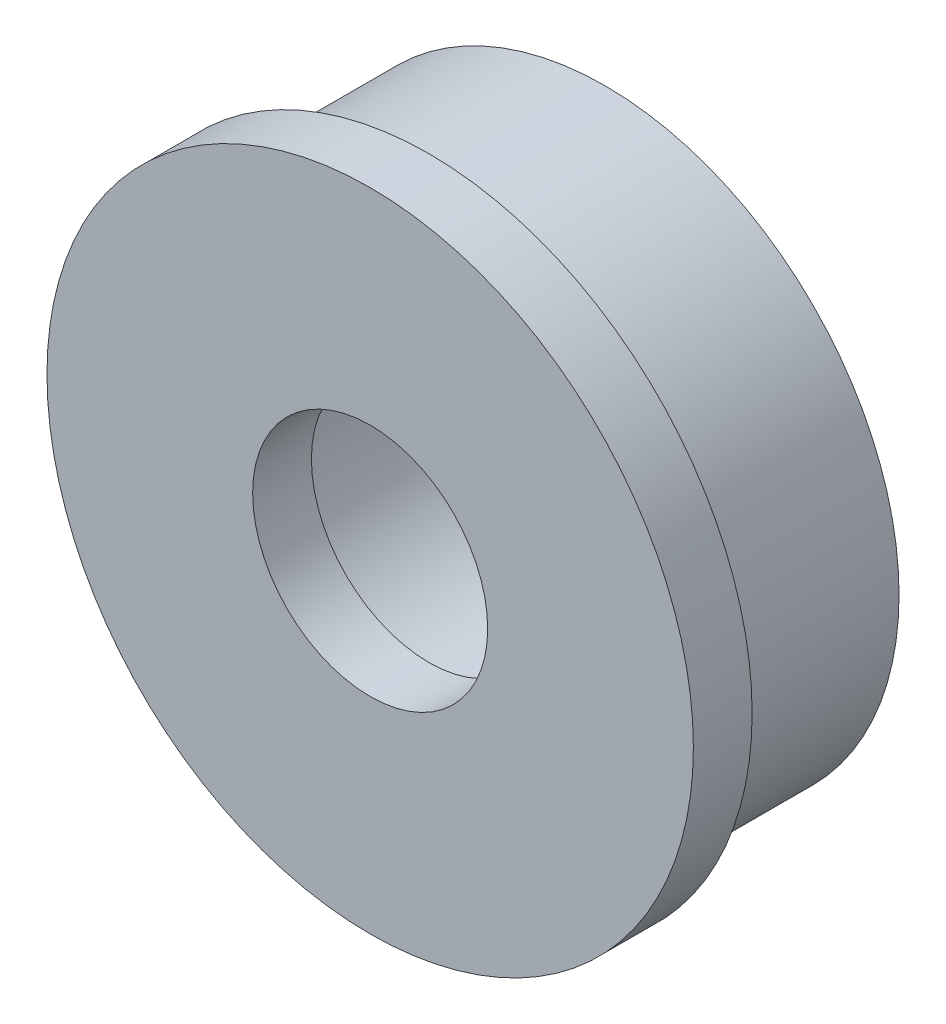
ISO-10303-21;
HEADER;
FILE_DESCRIPTION(('STEP AP214'),'2;1');
FILE_NAME('part.step','',(''),(''),'','','');
FILE_SCHEMA(('AUTOMOTIVE_DESIGN { 1 0 10303 214 1 1 1 1 }'));
ENDSEC;
DATA;
#1=APPLICATION_CONTEXT('core data for automotive mechanical design processes');
#2=APPLICATION_PROTOCOL_DEFINITION('international standard','automotive_design',2000,#1);
#3=PRODUCT_CONTEXT('',#1,'mechanical');
#4=PRODUCT('Part','Part','',(#3));
#5=PRODUCT_RELATED_PRODUCT_CATEGORY('part','',(#4));
#6=PRODUCT_DEFINITION_FORMATION('','',#4);
#7=PRODUCT_DEFINITION_CONTEXT('part definition',#1,'design');
#8=PRODUCT_DEFINITION('design','',#6,#7);
#9=PRODUCT_DEFINITION_SHAPE('','',#8);
#10=(LENGTH_UNIT() NAMED_UNIT(*) SI_UNIT(.MILLI.,.METRE.));
#11=(NAMED_UNIT(*) PLANE_ANGLE_UNIT() SI_UNIT($,.RADIAN.));
#12=(NAMED_UNIT(*) SI_UNIT($,.STERADIAN.) SOLID_ANGLE_UNIT());
#13=UNCERTAINTY_MEASURE_WITH_UNIT(LENGTH_MEASURE(1.E-05),#10,'distance_accuracy_value','');
#14=(GEOMETRIC_REPRESENTATION_CONTEXT(3) GLOBAL_UNCERTAINTY_ASSIGNED_CONTEXT((#13)) GLOBAL_UNIT_ASSIGNED_CONTEXT((#10,
#11,#12)) REPRESENTATION_CONTEXT('',''));
#15=CARTESIAN_POINT('',(0.,0.,0.));
#16=DIRECTION('',(0.,0.,1.));
#17=DIRECTION('',(1.,0.,0.));
#18=AXIS2_PLACEMENT_3D('',#15,#16,#17);
#19=CARTESIAN_POINT('',(0.,0.,0.));
#20=DIRECTION('',(0.,0.,1.));
#21=DIRECTION('',(1.,0.,0.));
#22=AXIS2_PLACEMENT_3D('',#19,#20,#21);
#23=PLANE('',#22);
#24=CARTESIAN_POINT('',(0.,0.,0.));
#25=DIRECTION('',(0.,0.,1.));
#26=DIRECTION('',(1.,0.,0.));
#27=AXIS2_PLACEMENT_3D('',#24,#25,#26);
#28=CIRCLE('',#27,5.);
#29=CARTESIAN_POINT('',(5.,0.,0.));
#30=VERTEX_POINT('',#29);
#31=EDGE_CURVE('E36',#30,#30,#28,.T.);
#32=ORIENTED_EDGE('',*,*,#31,.F.);
#33=EDGE_LOOP('',(#32));
#34=FACE_BOUND('',#33,.T.);
#35=CARTESIAN_POINT('',(0.,0.,0.));
#36=DIRECTION('',(0.,0.,1.));
#37=DIRECTION('',(1.,0.,0.));
#38=AXIS2_PLACEMENT_3D('',#35,#36,#37);
#39=CIRCLE('',#38,2.5);
#40=CARTESIAN_POINT('',(2.5,0.,0.));
#41=VERTEX_POINT('',#40);
#42=EDGE_CURVE('E43',#41,#41,#39,.T.);
#43=ORIENTED_EDGE('',*,*,#42,.T.);
#44=EDGE_LOOP('',(#43));
#45=FACE_BOUND('',#44,.T.);
#46=ADVANCED_FACE('F32',(#34,#45),#23,.F.);
#47=CARTESIAN_POINT('',(0.,0.,3.));
#48=DIRECTION('',(0.,0.,-1.));
#49=DIRECTION('',(-1.,0.,0.));
#50=AXIS2_PLACEMENT_3D('',#47,#48,#49);
#51=CYLINDRICAL_SURFACE('',#50,5.);
#52=CARTESIAN_POINT('',(0.,0.,3.));
#53=DIRECTION('',(0.,0.,1.));
#54=DIRECTION('',(1.,0.,0.));
#55=AXIS2_PLACEMENT_3D('',#52,#53,#54);
#56=CIRCLE('',#55,5.);
#57=CARTESIAN_POINT('',(5.,0.,3.));
#58=VERTEX_POINT('',#57);
#59=EDGE_CURVE('E10',#58,#58,#56,.T.);
#60=ORIENTED_EDGE('',*,*,#59,.F.);
#61=EDGE_LOOP('',(#60));
#62=FACE_BOUND('',#61,.T.);
#63=ORIENTED_EDGE('',*,*,#31,.T.);
#64=EDGE_LOOP('',(#63));
#65=FACE_BOUND('',#64,.T.);
#66=ADVANCED_FACE('F34',(#62,#65),#51,.T.);
#67=CARTESIAN_POINT('',(0.,0.,3.));
#68=DIRECTION('',(0.,0.,-1.));
#69=DIRECTION('',(-1.,0.,0.));
#70=AXIS2_PLACEMENT_3D('',#67,#68,#69);
#71=CYLINDRICAL_SURFACE('',#70,2.5);
#72=CARTESIAN_POINT('',(0.,0.,3.));
#73=DIRECTION('',(0.,0.,1.));
#74=DIRECTION('',(1.,0.,0.));
#75=AXIS2_PLACEMENT_3D('',#72,#73,#74);
#76=CIRCLE('',#75,2.5);
#77=CARTESIAN_POINT('',(2.5,0.,3.));
#78=VERTEX_POINT('',#77);
#79=EDGE_CURVE('E47',#78,#78,#76,.T.);
#80=ORIENTED_EDGE('',*,*,#79,.T.);
#81=EDGE_LOOP('',(#80));
#82=FACE_BOUND('',#81,.T.);
#83=ORIENTED_EDGE('',*,*,#42,.F.);
#84=EDGE_LOOP('',(#83));
#85=FACE_BOUND('',#84,.T.);
#86=ADVANCED_FACE('F78',(#82,#85),#71,.F.);
#87=CARTESIAN_POINT('',(0.,0.,3.));
#88=DIRECTION('',(0.,0.,1.));
#89=DIRECTION('',(1.,0.,0.));
#90=AXIS2_PLACEMENT_3D('',#87,#88,#89);
#91=PLANE('',#90);
#92=CARTESIAN_POINT('',(0.,0.,3.));
#93=DIRECTION('',(0.,0.,1.));
#94=DIRECTION('',(1.,0.,0.));
#95=AXIS2_PLACEMENT_3D('',#92,#93,#94);
#96=CIRCLE('',#95,2.);
#97=CARTESIAN_POINT('',(2.,0.,3.));
#98=VERTEX_POINT('',#97);
#99=EDGE_CURVE('E57',#98,#98,#96,.T.);
#100=ORIENTED_EDGE('',*,*,#99,.T.);
#101=EDGE_LOOP('',(#100));
#102=FACE_BOUND('',#101,.T.);
#103=ORIENTED_EDGE('',*,*,#79,.F.);
#104=EDGE_LOOP('',(#103));
#105=FACE_BOUND('',#104,.T.);
#106=ADVANCED_FACE('F69',(#102,#105),#91,.F.);
#107=CARTESIAN_POINT('',(0.,0.,4.));
#108=DIRECTION('',(0.,0.,1.));
#109=DIRECTION('',(1.,0.,0.));
#110=AXIS2_PLACEMENT_3D('',#107,#108,#109);
#111=PLANE('',#110);
#112=CARTESIAN_POINT('',(0.,0.,4.));
#113=DIRECTION('',(0.,0.,1.));
#114=DIRECTION('',(1.,0.,0.));
#115=AXIS2_PLACEMENT_3D('',#112,#113,#114);
#116=CIRCLE('',#115,5.5);
#117=CARTESIAN_POINT('',(5.5,0.,4.));
#118=VERTEX_POINT('',#117);
#119=EDGE_CURVE('E50',#118,#118,#116,.T.);
#120=ORIENTED_EDGE('',*,*,#119,.T.);
#121=EDGE_LOOP('',(#120));
#122=FACE_BOUND('',#121,.T.);
#123=CARTESIAN_POINT('',(0.,0.,4.));
#124=DIRECTION('',(0.,0.,1.));
#125=DIRECTION('',(1.,0.,0.));
#126=AXIS2_PLACEMENT_3D('',#123,#124,#125);
#127=CIRCLE('',#126,2.);
#128=CARTESIAN_POINT('',(2.,0.,4.));
#129=VERTEX_POINT('',#128);
#130=EDGE_CURVE('E54',#129,#129,#127,.T.);
#131=ORIENTED_EDGE('',*,*,#130,.F.);
#132=EDGE_LOOP('',(#131));
#133=FACE_BOUND('',#132,.T.);
#134=ADVANCED_FACE('F66',(#122,#133),#111,.T.);
#135=ORIENTED_EDGE('',*,*,#59,.T.);
#136=EDGE_LOOP('',(#135));
#137=FACE_BOUND('',#136,.T.);
#138=CARTESIAN_POINT('',(0.,0.,3.));
#139=DIRECTION('',(0.,0.,1.));
#140=DIRECTION('',(1.,0.,0.));
#141=AXIS2_PLACEMENT_3D('',#138,#139,#140);
#142=CIRCLE('',#141,5.5);
#143=CARTESIAN_POINT('',(5.5,0.,3.));
#144=VERTEX_POINT('',#143);
#145=EDGE_CURVE('E51',#144,#144,#142,.T.);
#146=ORIENTED_EDGE('',*,*,#145,.F.);
#147=EDGE_LOOP('',(#146));
#148=FACE_BOUND('',#147,.T.);
#149=ADVANCED_FACE('F68',(#137,#148),#91,.F.);
#150=CARTESIAN_POINT('',(0.,0.,4.));
#151=DIRECTION('',(0.,0.,-1.));
#152=DIRECTION('',(-1.,0.,0.));
#153=AXIS2_PLACEMENT_3D('',#150,#151,#152);
#154=CYLINDRICAL_SURFACE('',#153,5.5);
#155=ORIENTED_EDGE('',*,*,#119,.F.);
#156=EDGE_LOOP('',(#155));
#157=FACE_BOUND('',#156,.T.);
#158=ORIENTED_EDGE('',*,*,#145,.T.);
#159=EDGE_LOOP('',(#158));
#160=FACE_BOUND('',#159,.T.);
#161=ADVANCED_FACE('F76',(#157,#160),#154,.T.);
#162=CARTESIAN_POINT('',(0.,0.,4.));
#163=DIRECTION('',(0.,0.,-1.));
#164=DIRECTION('',(-1.,0.,0.));
#165=AXIS2_PLACEMENT_3D('',#162,#163,#164);
#166=CYLINDRICAL_SURFACE('',#165,2.);
#167=ORIENTED_EDGE('',*,*,#130,.T.);
#168=EDGE_LOOP('',(#167));
#169=FACE_BOUND('',#168,.T.);
#170=ORIENTED_EDGE('',*,*,#99,.F.);
#171=EDGE_LOOP('',(#170));
#172=FACE_BOUND('',#171,.T.);
#173=ADVANCED_FACE('F63',(#169,#172),#166,.F.);
#174=CLOSED_SHELL('',(#46,#66,#86,#106,#134,#149,#161,#173));
#175=MANIFOLD_SOLID_BREP('B2',#174);
#176=ADVANCED_BREP_SHAPE_REPRESENTATION('',(#18,#175),#14);
#177=SHAPE_DEFINITION_REPRESENTATION(#9,#176);
ENDSEC;
END-ISO-10303-21;
